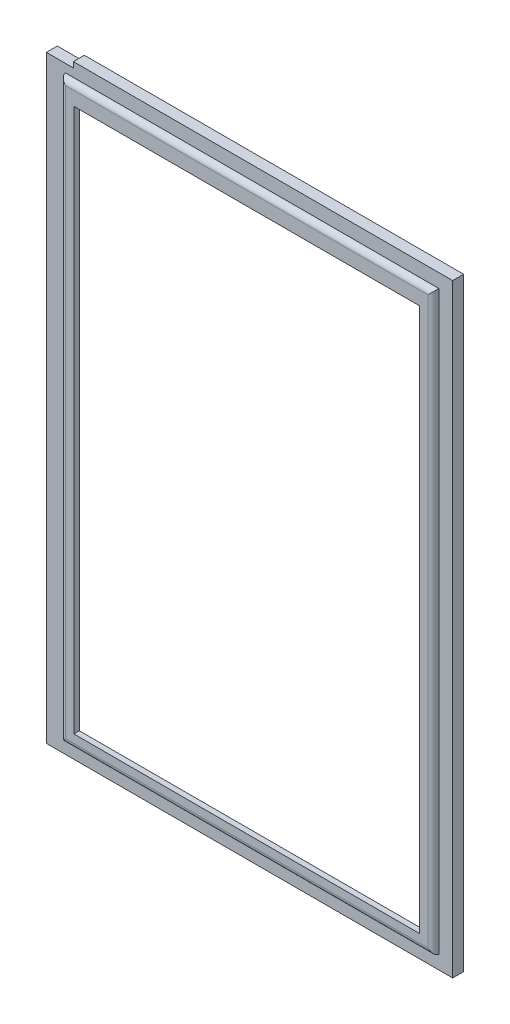
ISO-10303-21;
HEADER;
FILE_DESCRIPTION(('STEP AP214'),'2;1');
FILE_NAME('part.step','',(''),(''),'','','');
FILE_SCHEMA(('AUTOMOTIVE_DESIGN { 1 0 10303 214 1 1 1 1 }'));
ENDSEC;
DATA;
#1=APPLICATION_CONTEXT('core data for automotive mechanical design processes');
#2=APPLICATION_PROTOCOL_DEFINITION('international standard','automotive_design',2000,#1);
#3=PRODUCT_CONTEXT('',#1,'mechanical');
#4=PRODUCT('Part','Part','',(#3));
#5=PRODUCT_RELATED_PRODUCT_CATEGORY('part','',(#4));
#6=PRODUCT_DEFINITION_FORMATION('','',#4);
#7=PRODUCT_DEFINITION_CONTEXT('part definition',#1,'design');
#8=PRODUCT_DEFINITION('design','',#6,#7);
#9=PRODUCT_DEFINITION_SHAPE('','',#8);
#10=(LENGTH_UNIT() NAMED_UNIT(*) SI_UNIT(.MILLI.,.METRE.));
#11=(NAMED_UNIT(*) PLANE_ANGLE_UNIT() SI_UNIT($,.RADIAN.));
#12=(NAMED_UNIT(*) SI_UNIT($,.STERADIAN.) SOLID_ANGLE_UNIT());
#13=UNCERTAINTY_MEASURE_WITH_UNIT(LENGTH_MEASURE(1.E-05),#10,'distance_accuracy_value','');
#14=(GEOMETRIC_REPRESENTATION_CONTEXT(3) GLOBAL_UNCERTAINTY_ASSIGNED_CONTEXT((#13)) GLOBAL_UNIT_ASSIGNED_CONTEXT((#10,
#11,#12)) REPRESENTATION_CONTEXT('',''));
#15=CARTESIAN_POINT('',(0.,0.,0.));
#16=DIRECTION('',(0.,0.,1.));
#17=DIRECTION('',(1.,0.,0.));
#18=AXIS2_PLACEMENT_3D('',#15,#16,#17);
#19=CARTESIAN_POINT('',(0.,-1065.,20.));
#20=DIRECTION('',(-1.,0.,0.));
#21=DIRECTION('',(0.,0.,1.));
#22=AXIS2_PLACEMENT_3D('',#19,#20,#21);
#23=CYLINDRICAL_SURFACE('',#22,10.);
#24=CARTESIAN_POINT('',(705.,-1065.,20.));
#25=DIRECTION('',(-0.707106781186547,-0.707106781186548,0.));
#26=DIRECTION('',(0.707106781186547,-0.707106781186547,0.));
#27=AXIS2_PLACEMENT_3D('',#24,#25,#26);
#28=ELLIPSE('',#27,14.142135623731,10.);
#29=CARTESIAN_POINT('',(705.,-1065.,30.));
#30=VERTEX_POINT('',#29);
#31=CARTESIAN_POINT('',(715.,-1075.,20.));
#32=VERTEX_POINT('',#31);
#33=EDGE_CURVE('E12',#30,#32,#28,.F.);
#34=ORIENTED_EDGE('',*,*,#33,.F.);
#35=DIRECTION('',(1.,0.,0.));
#36=VECTOR('',#35,1.);
#37=CARTESIAN_POINT('',(0.,-1065.,30.));
#38=LINE('',#37,#36);
#39=CARTESIAN_POINT('',(45.0000000000001,-1065.,30.));
#40=VERTEX_POINT('',#39);
#41=EDGE_CURVE('E161',#40,#30,#38,.T.);
#42=ORIENTED_EDGE('',*,*,#41,.F.);
#43=CARTESIAN_POINT('',(45.0000000000001,-1065.,20.));
#44=DIRECTION('',(-0.707106781186548,0.707106781186547,0.));
#45=DIRECTION('',(-0.707106781186547,-0.707106781186548,0.));
#46=AXIS2_PLACEMENT_3D('',#43,#44,#45);
#47=ELLIPSE('',#46,14.1421356237309,10.);
#48=CARTESIAN_POINT('',(35.0000000000001,-1075.,20.));
#49=VERTEX_POINT('',#48);
#50=EDGE_CURVE('E51',#40,#49,#47,.F.);
#51=ORIENTED_EDGE('',*,*,#50,.T.);
#52=DIRECTION('',(1.,0.,0.));
#53=VECTOR('',#52,1.);
#54=CARTESIAN_POINT('',(35.0000000000001,-1075.,20.));
#55=LINE('',#54,#53);
#56=EDGE_CURVE('E154',#49,#32,#55,.T.);
#57=ORIENTED_EDGE('',*,*,#56,.T.);
#58=EDGE_LOOP('',(#34,#42,#51,#57));
#59=FACE_BOUND('',#58,.T.);
#60=ADVANCED_FACE('F44',(#59),#23,.T.);
#61=CARTESIAN_POINT('',(45.,0.,20.));
#62=DIRECTION('',(0.,1.,0.));
#63=DIRECTION('',(-1.,0.,0.));
#64=AXIS2_PLACEMENT_3D('',#61,#62,#63);
#65=CYLINDRICAL_SURFACE('',#64,10.);
#66=ORIENTED_EDGE('',*,*,#50,.F.);
#67=DIRECTION('',(0.,-1.,0.));
#68=VECTOR('',#67,1.);
#69=CARTESIAN_POINT('',(45.,0.,30.));
#70=LINE('',#69,#68);
#71=CARTESIAN_POINT('',(45.,-35.,30.));
#72=VERTEX_POINT('',#71);
#73=EDGE_CURVE('E164',#72,#40,#70,.T.);
#74=ORIENTED_EDGE('',*,*,#73,.F.);
#75=CARTESIAN_POINT('',(45.,-35.,20.));
#76=DIRECTION('',(0.707106781186547,0.707106781186548,0.));
#77=DIRECTION('',(-0.707106781186548,0.707106781186547,0.));
#78=AXIS2_PLACEMENT_3D('',#75,#76,#77);
#79=ELLIPSE('',#78,14.142135623731,10.);
#80=CARTESIAN_POINT('',(35.,-25.,20.));
#81=VERTEX_POINT('',#80);
#82=EDGE_CURVE('E66',#72,#81,#79,.F.);
#83=ORIENTED_EDGE('',*,*,#82,.T.);
#84=DIRECTION('',(0.,-1.,0.));
#85=VECTOR('',#84,1.);
#86=CARTESIAN_POINT('',(35.,-25.,20.));
#87=LINE('',#86,#85);
#88=EDGE_CURVE('E128',#81,#49,#87,.T.);
#89=ORIENTED_EDGE('',*,*,#88,.T.);
#90=EDGE_LOOP('',(#66,#74,#83,#89));
#91=FACE_BOUND('',#90,.T.);
#92=ADVANCED_FACE('F183',(#91),#65,.T.);
#93=CARTESIAN_POINT('',(0.,-35.,20.));
#94=DIRECTION('',(1.,0.,0.));
#95=DIRECTION('',(0.,1.,0.));
#96=AXIS2_PLACEMENT_3D('',#93,#94,#95);
#97=CYLINDRICAL_SURFACE('',#96,10.);
#98=ORIENTED_EDGE('',*,*,#82,.F.);
#99=DIRECTION('',(-1.,0.,0.));
#100=VECTOR('',#99,1.);
#101=CARTESIAN_POINT('',(0.,-35.,30.));
#102=LINE('',#101,#100);
#103=CARTESIAN_POINT('',(705.,-35.,30.));
#104=VERTEX_POINT('',#103);
#105=EDGE_CURVE('E167',#104,#72,#102,.T.);
#106=ORIENTED_EDGE('',*,*,#105,.F.);
#107=CARTESIAN_POINT('',(705.,-35.,20.));
#108=DIRECTION('',(0.707106781186547,-0.707106781186547,0.));
#109=DIRECTION('',(0.707106781186547,0.707106781186548,0.));
#110=AXIS2_PLACEMENT_3D('',#107,#108,#109);
#111=ELLIPSE('',#110,14.1421356237309,10.);
#112=CARTESIAN_POINT('',(715.,-25.,20.));
#113=VERTEX_POINT('',#112);
#114=EDGE_CURVE('E58',#104,#113,#111,.F.);
#115=ORIENTED_EDGE('',*,*,#114,.T.);
#116=DIRECTION('',(-1.,0.,0.));
#117=VECTOR('',#116,1.);
#118=CARTESIAN_POINT('',(35.,-25.,20.));
#119=LINE('',#118,#117);
#120=EDGE_CURVE('E159',#113,#81,#119,.T.);
#121=ORIENTED_EDGE('',*,*,#120,.T.);
#122=EDGE_LOOP('',(#98,#106,#115,#121));
#123=FACE_BOUND('',#122,.T.);
#124=ADVANCED_FACE('F184',(#123),#97,.T.);
#125=CARTESIAN_POINT('',(705.,0.,20.));
#126=DIRECTION('',(0.,-1.,0.));
#127=DIRECTION('',(1.,0.,0.));
#128=AXIS2_PLACEMENT_3D('',#125,#126,#127);
#129=CYLINDRICAL_SURFACE('',#128,10.);
#130=DIRECTION('',(0.,1.,0.));
#131=VECTOR('',#130,1.);
#132=CARTESIAN_POINT('',(705.,0.,30.));
#133=LINE('',#132,#131);
#134=EDGE_CURVE('E169',#30,#104,#133,.T.);
#135=ORIENTED_EDGE('',*,*,#134,.F.);
#136=ORIENTED_EDGE('',*,*,#33,.T.);
#137=DIRECTION('',(0.,1.,0.));
#138=VECTOR('',#137,1.);
#139=CARTESIAN_POINT('',(715.,-25.,20.));
#140=LINE('',#139,#138);
#141=EDGE_CURVE('E157',#32,#113,#140,.T.);
#142=ORIENTED_EDGE('',*,*,#141,.T.);
#143=ORIENTED_EDGE('',*,*,#114,.F.);
#144=EDGE_LOOP('',(#135,#136,#142,#143));
#145=FACE_BOUND('',#144,.T.);
#146=ADVANCED_FACE('F185',(#145),#129,.T.);
#147=CARTESIAN_POINT('',(0.,0.,30.));
#148=DIRECTION('',(0.,0.,1.));
#149=DIRECTION('',(1.,0.,0.));
#150=AXIS2_PLACEMENT_3D('',#147,#148,#149);
#151=PLANE('',#150);
#152=ORIENTED_EDGE('',*,*,#41,.T.);
#153=ORIENTED_EDGE('',*,*,#134,.T.);
#154=ORIENTED_EDGE('',*,*,#105,.T.);
#155=ORIENTED_EDGE('',*,*,#73,.T.);
#156=EDGE_LOOP('',(#152,#153,#154,#155));
#157=FACE_BOUND('',#156,.T.);
#158=DIRECTION('',(1.,0.,0.));
#159=VECTOR('',#158,1.);
#160=CARTESIAN_POINT('',(60.0000000000001,-1050.,30.));
#161=LINE('',#160,#159);
#162=CARTESIAN_POINT('',(60.0000000000001,-1050.,30.));
#163=VERTEX_POINT('',#162);
#164=CARTESIAN_POINT('',(690.,-1050.,30.));
#165=VERTEX_POINT('',#164);
#166=EDGE_CURVE('E120',#163,#165,#161,.T.);
#167=ORIENTED_EDGE('',*,*,#166,.F.);
#168=DIRECTION('',(0.,-1.,0.));
#169=VECTOR('',#168,1.);
#170=CARTESIAN_POINT('',(60.0000000000001,-1050.,30.));
#171=LINE('',#170,#169);
#172=CARTESIAN_POINT('',(60.0000000000001,-60.,30.));
#173=VERTEX_POINT('',#172);
#174=EDGE_CURVE('E110',#173,#163,#171,.T.);
#175=ORIENTED_EDGE('',*,*,#174,.F.);
#176=DIRECTION('',(-1.,0.,0.));
#177=VECTOR('',#176,1.);
#178=CARTESIAN_POINT('',(60.0000000000001,-60.,30.));
#179=LINE('',#178,#177);
#180=CARTESIAN_POINT('',(690.,-60.0000000000001,30.));
#181=VERTEX_POINT('',#180);
#182=EDGE_CURVE('E136',#181,#173,#179,.T.);
#183=ORIENTED_EDGE('',*,*,#182,.F.);
#184=DIRECTION('',(0.,1.,0.));
#185=VECTOR('',#184,1.);
#186=CARTESIAN_POINT('',(690.,-1050.,30.));
#187=LINE('',#186,#185);
#188=EDGE_CURVE('E134',#165,#181,#187,.T.);
#189=ORIENTED_EDGE('',*,*,#188,.F.);
#190=EDGE_LOOP('',(#167,#175,#183,#189));
#191=FACE_BOUND('',#190,.T.);
#192=ADVANCED_FACE('F132',(#157,#191),#151,.T.);
#193=CARTESIAN_POINT('',(0.,0.,20.));
#194=DIRECTION('',(0.,0.,1.));
#195=DIRECTION('',(1.,0.,0.));
#196=AXIS2_PLACEMENT_3D('',#193,#194,#195);
#197=PLANE('',#196);
#198=ORIENTED_EDGE('',*,*,#88,.F.);
#199=ORIENTED_EDGE('',*,*,#120,.F.);
#200=ORIENTED_EDGE('',*,*,#141,.F.);
#201=ORIENTED_EDGE('',*,*,#56,.F.);
#202=EDGE_LOOP('',(#198,#199,#200,#201));
#203=FACE_BOUND('',#202,.T.);
#204=DIRECTION('',(0.,-1.,0.));
#205=VECTOR('',#204,1.);
#206=CARTESIAN_POINT('',(60.0000000000001,-1050.,20.));
#207=LINE('',#206,#205);
#208=CARTESIAN_POINT('',(60.0000000000001,-60.,20.));
#209=VERTEX_POINT('',#208);
#210=CARTESIAN_POINT('',(60.0000000000001,-1050.,20.));
#211=VERTEX_POINT('',#210);
#212=EDGE_CURVE('E140',#209,#211,#207,.T.);
#213=ORIENTED_EDGE('',*,*,#212,.T.);
#214=DIRECTION('',(1.,0.,0.));
#215=VECTOR('',#214,1.);
#216=CARTESIAN_POINT('',(60.0000000000001,-1050.,20.));
#217=LINE('',#216,#215);
#218=CARTESIAN_POINT('',(690.,-1050.,20.));
#219=VERTEX_POINT('',#218);
#220=EDGE_CURVE('E127',#211,#219,#217,.T.);
#221=ORIENTED_EDGE('',*,*,#220,.T.);
#222=DIRECTION('',(0.,1.,0.));
#223=VECTOR('',#222,1.);
#224=CARTESIAN_POINT('',(690.,-1050.,20.));
#225=LINE('',#224,#223);
#226=CARTESIAN_POINT('',(690.,-60.0000000000001,20.));
#227=VERTEX_POINT('',#226);
#228=EDGE_CURVE('E143',#219,#227,#225,.T.);
#229=ORIENTED_EDGE('',*,*,#228,.T.);
#230=DIRECTION('',(-1.,0.,0.));
#231=VECTOR('',#230,1.);
#232=CARTESIAN_POINT('',(60.0000000000001,-60.,20.));
#233=LINE('',#232,#231);
#234=EDGE_CURVE('E121',#227,#209,#233,.T.);
#235=ORIENTED_EDGE('',*,*,#234,.T.);
#236=EDGE_LOOP('',(#213,#221,#229,#235));
#237=FACE_BOUND('',#236,.T.);
#238=ADVANCED_FACE('F180',(#203,#237),#197,.F.);
#239=CARTESIAN_POINT('',(60.0000000000001,-1050.,30.));
#240=DIRECTION('',(1.,0.,0.));
#241=DIRECTION('',(0.,0.,-1.));
#242=AXIS2_PLACEMENT_3D('',#239,#240,#241);
#243=PLANE('',#242);
#244=ORIENTED_EDGE('',*,*,#212,.F.);
#245=DIRECTION('',(0.,0.,-1.));
#246=VECTOR('',#245,1.);
#247=CARTESIAN_POINT('',(60.0000000000001,-60.,30.));
#248=LINE('',#247,#246);
#249=EDGE_CURVE('E116',#173,#209,#248,.T.);
#250=ORIENTED_EDGE('',*,*,#249,.F.);
#251=ORIENTED_EDGE('',*,*,#174,.T.);
#252=DIRECTION('',(0.,0.,-1.));
#253=VECTOR('',#252,1.);
#254=CARTESIAN_POINT('',(60.0000000000001,-1050.,30.));
#255=LINE('',#254,#253);
#256=EDGE_CURVE('E113',#163,#211,#255,.T.);
#257=ORIENTED_EDGE('',*,*,#256,.T.);
#258=EDGE_LOOP('',(#244,#250,#251,#257));
#259=FACE_BOUND('',#258,.T.);
#260=ADVANCED_FACE('F112',(#259),#243,.T.);
#261=CARTESIAN_POINT('',(60.0000000000001,-1050.,30.));
#262=DIRECTION('',(0.,1.,0.));
#263=DIRECTION('',(0.,0.,1.));
#264=AXIS2_PLACEMENT_3D('',#261,#262,#263);
#265=PLANE('',#264);
#266=ORIENTED_EDGE('',*,*,#220,.F.);
#267=ORIENTED_EDGE('',*,*,#256,.F.);
#268=ORIENTED_EDGE('',*,*,#166,.T.);
#269=DIRECTION('',(0.,0.,-1.));
#270=VECTOR('',#269,1.);
#271=CARTESIAN_POINT('',(690.,-1050.,30.));
#272=LINE('',#271,#270);
#273=EDGE_CURVE('E129',#165,#219,#272,.T.);
#274=ORIENTED_EDGE('',*,*,#273,.T.);
#275=EDGE_LOOP('',(#266,#267,#268,#274));
#276=FACE_BOUND('',#275,.T.);
#277=ADVANCED_FACE('F124',(#276),#265,.T.);
#278=CARTESIAN_POINT('',(690.,-1050.,30.));
#279=DIRECTION('',(-1.,0.,0.));
#280=DIRECTION('',(0.,0.,1.));
#281=AXIS2_PLACEMENT_3D('',#278,#279,#280);
#282=PLANE('',#281);
#283=ORIENTED_EDGE('',*,*,#228,.F.);
#284=ORIENTED_EDGE('',*,*,#273,.F.);
#285=ORIENTED_EDGE('',*,*,#188,.T.);
#286=DIRECTION('',(0.,0.,-1.));
#287=VECTOR('',#286,1.);
#288=CARTESIAN_POINT('',(690.,-60.0000000000001,30.));
#289=LINE('',#288,#287);
#290=EDGE_CURVE('E149',#181,#227,#289,.T.);
#291=ORIENTED_EDGE('',*,*,#290,.T.);
#292=EDGE_LOOP('',(#283,#284,#285,#291));
#293=FACE_BOUND('',#292,.T.);
#294=ADVANCED_FACE('F235',(#293),#282,.T.);
#295=CARTESIAN_POINT('',(60.0000000000001,-60.,30.));
#296=DIRECTION('',(0.,-1.,0.));
#297=DIRECTION('',(1.,0.,0.));
#298=AXIS2_PLACEMENT_3D('',#295,#296,#297);
#299=PLANE('',#298);
#300=ORIENTED_EDGE('',*,*,#234,.F.);
#301=ORIENTED_EDGE('',*,*,#290,.F.);
#302=ORIENTED_EDGE('',*,*,#182,.T.);
#303=ORIENTED_EDGE('',*,*,#249,.T.);
#304=EDGE_LOOP('',(#300,#301,#302,#303));
#305=FACE_BOUND('',#304,.T.);
#306=ADVANCED_FACE('F243',(#305),#299,.T.);
#307=CLOSED_SHELL('',(#60,#92,#124,#146,#192,#238,#260,#277,#294,#306));
#308=MANIFOLD_SOLID_BREP('B2',#307);
#309=CARTESIAN_POINT('',(0.,0.,20.));
#310=DIRECTION('',(0.,0.,1.));
#311=DIRECTION('',(1.,0.,0.));
#312=AXIS2_PLACEMENT_3D('',#309,#310,#311);
#313=PLANE('',#312);
#314=DIRECTION('',(0.,1.,0.));
#315=VECTOR('',#314,1.);
#316=CARTESIAN_POINT('',(49.143238,0.,20.));
#317=LINE('',#316,#315);
#318=CARTESIAN_POINT('',(49.143238,-10.,20.));
#319=VERTEX_POINT('',#318);
#320=CARTESIAN_POINT('',(49.143238,0.,20.));
#321=VERTEX_POINT('',#320);
#322=EDGE_CURVE('E288',#319,#321,#317,.T.);
#323=ORIENTED_EDGE('',*,*,#322,.F.);
#324=DIRECTION('',(1.,0.,0.));
#325=VECTOR('',#324,1.);
#326=CARTESIAN_POINT('',(0.,-10.,20.));
#327=LINE('',#326,#325);
#328=CARTESIAN_POINT('',(0.,-10.,20.));
#329=VERTEX_POINT('',#328);
#330=EDGE_CURVE('E438',#329,#319,#327,.T.);
#331=ORIENTED_EDGE('',*,*,#330,.F.);
#332=DIRECTION('',(0.,-1.,0.));
#333=VECTOR('',#332,1.);
#334=CARTESIAN_POINT('',(0.,0.,20.));
#335=LINE('',#334,#333);
#336=CARTESIAN_POINT('',(1.34711147906209E-13,-1100.,20.));
#337=VERTEX_POINT('',#336);
#338=EDGE_CURVE('E368',#329,#337,#335,.T.);
#339=ORIENTED_EDGE('',*,*,#338,.T.);
#340=DIRECTION('',(1.,0.,0.));
#341=VECTOR('',#340,1.);
#342=CARTESIAN_POINT('',(1.34711147906209E-13,-1100.,20.));
#343=LINE('',#342,#341);
#344=CARTESIAN_POINT('',(740.,-1100.,20.));
#345=VERTEX_POINT('',#344);
#346=EDGE_CURVE('E407',#337,#345,#343,.T.);
#347=ORIENTED_EDGE('',*,*,#346,.T.);
#348=DIRECTION('',(0.,1.,0.));
#349=VECTOR('',#348,1.);
#350=CARTESIAN_POINT('',(740.,-1100.,20.));
#351=LINE('',#350,#349);
#352=CARTESIAN_POINT('',(740.,0.,20.));
#353=VERTEX_POINT('',#352);
#354=EDGE_CURVE('E397',#345,#353,#351,.T.);
#355=ORIENTED_EDGE('',*,*,#354,.T.);
#356=DIRECTION('',(-1.,0.,0.));
#357=VECTOR('',#356,1.);
#358=CARTESIAN_POINT('',(0.,0.,20.));
#359=LINE('',#358,#357);
#360=EDGE_CURVE('E382',#353,#321,#359,.T.);
#361=ORIENTED_EDGE('',*,*,#360,.T.);
#362=EDGE_LOOP('',(#323,#331,#339,#347,#355,#361));
#363=FACE_BOUND('',#362,.T.);
#364=DIRECTION('',(1.,0.,0.));
#365=VECTOR('',#364,1.);
#366=CARTESIAN_POINT('',(35.0000000000001,-1075.,20.));
#367=LINE('',#366,#365);
#368=CARTESIAN_POINT('',(35.0000000000001,-1075.,20.));
#369=VERTEX_POINT('',#368);
#370=CARTESIAN_POINT('',(715.,-1075.,20.));
#371=VERTEX_POINT('',#370);
#372=EDGE_CURVE('E432',#369,#371,#367,.T.);
#373=ORIENTED_EDGE('',*,*,#372,.F.);
#374=DIRECTION('',(0.,-1.,0.));
#375=VECTOR('',#374,1.);
#376=CARTESIAN_POINT('',(35.,-25.,20.));
#377=LINE('',#376,#375);
#378=CARTESIAN_POINT('',(35.,-25.,20.));
#379=VERTEX_POINT('',#378);
#380=EDGE_CURVE('E420',#379,#369,#377,.T.);
#381=ORIENTED_EDGE('',*,*,#380,.F.);
#382=DIRECTION('',(-1.,0.,0.));
#383=VECTOR('',#382,1.);
#384=CARTESIAN_POINT('',(35.,-25.,20.));
#385=LINE('',#384,#383);
#386=CARTESIAN_POINT('',(715.,-25.,20.));
#387=VERTEX_POINT('',#386);
#388=EDGE_CURVE('E416',#387,#379,#385,.T.);
#389=ORIENTED_EDGE('',*,*,#388,.F.);
#390=DIRECTION('',(0.,1.,0.));
#391=VECTOR('',#390,1.);
#392=CARTESIAN_POINT('',(715.,-25.,20.));
#393=LINE('',#392,#391);
#394=EDGE_CURVE('E430',#371,#387,#393,.T.);
#395=ORIENTED_EDGE('',*,*,#394,.F.);
#396=EDGE_LOOP('',(#373,#381,#389,#395));
#397=FACE_BOUND('',#396,.T.);
#398=ADVANCED_FACE('F273',(#363,#397),#313,.T.);
#399=CARTESIAN_POINT('',(0.,0.,0.));
#400=DIRECTION('',(0.,0.,1.));
#401=DIRECTION('',(1.,0.,0.));
#402=AXIS2_PLACEMENT_3D('',#399,#400,#401);
#403=PLANE('',#402);
#404=DIRECTION('',(-1.,0.,0.));
#405=VECTOR('',#404,1.);
#406=CARTESIAN_POINT('',(0.,-10.,0.));
#407=LINE('',#406,#405);
#408=CARTESIAN_POINT('',(49.143238,-10.,0.));
#409=VERTEX_POINT('',#408);
#410=CARTESIAN_POINT('',(0.,-10.,0.));
#411=VERTEX_POINT('',#410);
#412=EDGE_CURVE('E349',#409,#411,#407,.T.);
#413=ORIENTED_EDGE('',*,*,#412,.F.);
#414=DIRECTION('',(0.,-1.,0.));
#415=VECTOR('',#414,1.);
#416=CARTESIAN_POINT('',(49.143238,0.,0.));
#417=LINE('',#416,#415);
#418=CARTESIAN_POINT('',(49.143238,0.,0.));
#419=VERTEX_POINT('',#418);
#420=EDGE_CURVE('E401',#419,#409,#417,.T.);
#421=ORIENTED_EDGE('',*,*,#420,.F.);
#422=DIRECTION('',(-1.,0.,0.));
#423=VECTOR('',#422,1.);
#424=CARTESIAN_POINT('',(0.,0.,0.));
#425=LINE('',#424,#423);
#426=CARTESIAN_POINT('',(740.,0.,0.));
#427=VERTEX_POINT('',#426);
#428=EDGE_CURVE('E386',#427,#419,#425,.T.);
#429=ORIENTED_EDGE('',*,*,#428,.F.);
#430=DIRECTION('',(0.,1.,0.));
#431=VECTOR('',#430,1.);
#432=CARTESIAN_POINT('',(740.,-1100.,0.));
#433=LINE('',#432,#431);
#434=CARTESIAN_POINT('',(740.,-1100.,0.));
#435=VERTEX_POINT('',#434);
#436=EDGE_CURVE('E376',#435,#427,#433,.T.);
#437=ORIENTED_EDGE('',*,*,#436,.F.);
#438=DIRECTION('',(1.,0.,0.));
#439=VECTOR('',#438,1.);
#440=CARTESIAN_POINT('',(1.34711147906209E-13,-1100.,0.));
#441=LINE('',#440,#439);
#442=CARTESIAN_POINT('',(1.34711147906209E-13,-1100.,0.));
#443=VERTEX_POINT('',#442);
#444=EDGE_CURVE('E373',#443,#435,#441,.T.);
#445=ORIENTED_EDGE('',*,*,#444,.F.);
#446=DIRECTION('',(0.,-1.,0.));
#447=VECTOR('',#446,1.);
#448=CARTESIAN_POINT('',(0.,0.,0.));
#449=LINE('',#448,#447);
#450=EDGE_CURVE('E366',#411,#443,#449,.T.);
#451=ORIENTED_EDGE('',*,*,#450,.F.);
#452=EDGE_LOOP('',(#413,#421,#429,#437,#445,#451));
#453=FACE_BOUND('',#452,.T.);
#454=DIRECTION('',(0.,-1.,0.));
#455=VECTOR('',#454,1.);
#456=CARTESIAN_POINT('',(35.,-25.,0.));
#457=LINE('',#456,#455);
#458=CARTESIAN_POINT('',(35.,-25.,0.));
#459=VERTEX_POINT('',#458);
#460=CARTESIAN_POINT('',(35.0000000000001,-1075.,0.));
#461=VERTEX_POINT('',#460);
#462=EDGE_CURVE('E360',#459,#461,#457,.T.);
#463=ORIENTED_EDGE('',*,*,#462,.T.);
#464=DIRECTION('',(1.,0.,0.));
#465=VECTOR('',#464,1.);
#466=CARTESIAN_POINT('',(35.0000000000001,-1075.,0.));
#467=LINE('',#466,#465);
#468=CARTESIAN_POINT('',(715.,-1075.,0.));
#469=VERTEX_POINT('',#468);
#470=EDGE_CURVE('E424',#461,#469,#467,.T.);
#471=ORIENTED_EDGE('',*,*,#470,.T.);
#472=DIRECTION('',(0.,1.,0.));
#473=VECTOR('',#472,1.);
#474=CARTESIAN_POINT('',(715.,-25.,0.));
#475=LINE('',#474,#473);
#476=CARTESIAN_POINT('',(715.,-25.,0.));
#477=VERTEX_POINT('',#476);
#478=EDGE_CURVE('E421',#469,#477,#475,.T.);
#479=ORIENTED_EDGE('',*,*,#478,.T.);
#480=DIRECTION('',(-1.,0.,0.));
#481=VECTOR('',#480,1.);
#482=CARTESIAN_POINT('',(35.,-25.,0.));
#483=LINE('',#482,#481);
#484=EDGE_CURVE('E417',#477,#459,#483,.T.);
#485=ORIENTED_EDGE('',*,*,#484,.T.);
#486=EDGE_LOOP('',(#463,#471,#479,#485));
#487=FACE_BOUND('',#486,.T.);
#488=ADVANCED_FACE('F370',(#453,#487),#403,.F.);
#489=CARTESIAN_POINT('',(0.,0.,20.));
#490=DIRECTION('',(1.,0.,0.));
#491=DIRECTION('',(0.,1.,0.));
#492=AXIS2_PLACEMENT_3D('',#489,#490,#491);
#493=PLANE('',#492);
#494=ORIENTED_EDGE('',*,*,#338,.F.);
#495=DIRECTION('',(0.,0.,1.));
#496=VECTOR('',#495,1.);
#497=CARTESIAN_POINT('',(0.,-10.,-0.001000000000001));
#498=LINE('',#497,#496);
#499=EDGE_CURVE('E353',#411,#329,#498,.T.);
#500=ORIENTED_EDGE('',*,*,#499,.F.);
#501=ORIENTED_EDGE('',*,*,#450,.T.);
#502=DIRECTION('',(0.,0.,-1.));
#503=VECTOR('',#502,1.);
#504=CARTESIAN_POINT('',(1.34711147906209E-13,-1100.,20.));
#505=LINE('',#504,#503);
#506=EDGE_CURVE('E42',#337,#443,#505,.T.);
#507=ORIENTED_EDGE('',*,*,#506,.F.);
#508=EDGE_LOOP('',(#494,#500,#501,#507));
#509=FACE_BOUND('',#508,.T.);
#510=ADVANCED_FACE('F275',(#509),#493,.F.);
#511=CARTESIAN_POINT('',(1.34711147906209E-13,-1100.,20.));
#512=DIRECTION('',(0.,1.,0.));
#513=DIRECTION('',(0.,0.,1.));
#514=AXIS2_PLACEMENT_3D('',#511,#512,#513);
#515=PLANE('',#514);
#516=ORIENTED_EDGE('',*,*,#444,.T.);
#517=DIRECTION('',(0.,0.,-1.));
#518=VECTOR('',#517,1.);
#519=CARTESIAN_POINT('',(740.,-1100.,20.));
#520=LINE('',#519,#518);
#521=EDGE_CURVE('E281',#345,#435,#520,.T.);
#522=ORIENTED_EDGE('',*,*,#521,.F.);
#523=ORIENTED_EDGE('',*,*,#346,.F.);
#524=ORIENTED_EDGE('',*,*,#506,.T.);
#525=EDGE_LOOP('',(#516,#522,#523,#524));
#526=FACE_BOUND('',#525,.T.);
#527=ADVANCED_FACE('F478',(#526),#515,.F.);
#528=CARTESIAN_POINT('',(740.,-1100.,20.));
#529=DIRECTION('',(-1.,0.,0.));
#530=DIRECTION('',(0.,-1.,0.));
#531=AXIS2_PLACEMENT_3D('',#528,#529,#530);
#532=PLANE('',#531);
#533=ORIENTED_EDGE('',*,*,#436,.T.);
#534=DIRECTION('',(0.,0.,-1.));
#535=VECTOR('',#534,1.);
#536=CARTESIAN_POINT('',(740.,0.,20.));
#537=LINE('',#536,#535);
#538=EDGE_CURVE('E389',#353,#427,#537,.T.);
#539=ORIENTED_EDGE('',*,*,#538,.F.);
#540=ORIENTED_EDGE('',*,*,#354,.F.);
#541=ORIENTED_EDGE('',*,*,#521,.T.);
#542=EDGE_LOOP('',(#533,#539,#540,#541));
#543=FACE_BOUND('',#542,.T.);
#544=ADVANCED_FACE('F395',(#543),#532,.F.);
#545=CARTESIAN_POINT('',(0.,0.,20.));
#546=DIRECTION('',(0.,-1.,0.));
#547=DIRECTION('',(0.,0.,-1.));
#548=AXIS2_PLACEMENT_3D('',#545,#546,#547);
#549=PLANE('',#548);
#550=ORIENTED_EDGE('',*,*,#428,.T.);
#551=DIRECTION('',(0.,0.,1.));
#552=VECTOR('',#551,1.);
#553=CARTESIAN_POINT('',(49.143238,0.,-0.001000000000001));
#554=LINE('',#553,#552);
#555=EDGE_CURVE('E361',#419,#321,#554,.T.);
#556=ORIENTED_EDGE('',*,*,#555,.T.);
#557=ORIENTED_EDGE('',*,*,#360,.F.);
#558=ORIENTED_EDGE('',*,*,#538,.T.);
#559=EDGE_LOOP('',(#550,#556,#557,#558));
#560=FACE_BOUND('',#559,.T.);
#561=ADVANCED_FACE('F403',(#560),#549,.F.);
#562=CARTESIAN_POINT('',(35.,-25.,20.));
#563=DIRECTION('',(1.,0.,0.));
#564=DIRECTION('',(0.,1.,0.));
#565=AXIS2_PLACEMENT_3D('',#562,#563,#564);
#566=PLANE('',#565);
#567=ORIENTED_EDGE('',*,*,#462,.F.);
#568=DIRECTION('',(0.,0.,-1.));
#569=VECTOR('',#568,1.);
#570=CARTESIAN_POINT('',(35.,-25.,20.));
#571=LINE('',#570,#569);
#572=EDGE_CURVE('E413',#379,#459,#571,.T.);
#573=ORIENTED_EDGE('',*,*,#572,.F.);
#574=ORIENTED_EDGE('',*,*,#380,.T.);
#575=DIRECTION('',(0.,0.,-1.));
#576=VECTOR('',#575,1.);
#577=CARTESIAN_POINT('',(35.0000000000001,-1075.,20.));
#578=LINE('',#577,#576);
#579=EDGE_CURVE('E374',#369,#461,#578,.T.);
#580=ORIENTED_EDGE('',*,*,#579,.T.);
#581=EDGE_LOOP('',(#567,#573,#574,#580));
#582=FACE_BOUND('',#581,.T.);
#583=ADVANCED_FACE('F456',(#582),#566,.T.);
#584=CARTESIAN_POINT('',(35.0000000000001,-1075.,20.));
#585=DIRECTION('',(0.,1.,0.));
#586=DIRECTION('',(0.,0.,1.));
#587=AXIS2_PLACEMENT_3D('',#584,#585,#586);
#588=PLANE('',#587);
#589=ORIENTED_EDGE('',*,*,#470,.F.);
#590=ORIENTED_EDGE('',*,*,#579,.F.);
#591=ORIENTED_EDGE('',*,*,#372,.T.);
#592=DIRECTION('',(0.,0.,-1.));
#593=VECTOR('',#592,1.);
#594=CARTESIAN_POINT('',(715.,-1075.,20.));
#595=LINE('',#594,#593);
#596=EDGE_CURVE('E379',#371,#469,#595,.T.);
#597=ORIENTED_EDGE('',*,*,#596,.T.);
#598=EDGE_LOOP('',(#589,#590,#591,#597));
#599=FACE_BOUND('',#598,.T.);
#600=ADVANCED_FACE('F451',(#599),#588,.T.);
#601=CARTESIAN_POINT('',(715.,-25.,20.));
#602=DIRECTION('',(-1.,0.,0.));
#603=DIRECTION('',(0.,-1.,0.));
#604=AXIS2_PLACEMENT_3D('',#601,#602,#603);
#605=PLANE('',#604);
#606=ORIENTED_EDGE('',*,*,#478,.F.);
#607=ORIENTED_EDGE('',*,*,#596,.F.);
#608=ORIENTED_EDGE('',*,*,#394,.T.);
#609=DIRECTION('',(0.,0.,-1.));
#610=VECTOR('',#609,1.);
#611=CARTESIAN_POINT('',(715.,-25.,20.));
#612=LINE('',#611,#610);
#613=EDGE_CURVE('E296',#387,#477,#612,.T.);
#614=ORIENTED_EDGE('',*,*,#613,.T.);
#615=EDGE_LOOP('',(#606,#607,#608,#614));
#616=FACE_BOUND('',#615,.T.);
#617=ADVANCED_FACE('F454',(#616),#605,.T.);
#618=CARTESIAN_POINT('',(35.,-25.,20.));
#619=DIRECTION('',(0.,-1.,0.));
#620=DIRECTION('',(0.,0.,-1.));
#621=AXIS2_PLACEMENT_3D('',#618,#619,#620);
#622=PLANE('',#621);
#623=ORIENTED_EDGE('',*,*,#484,.F.);
#624=ORIENTED_EDGE('',*,*,#613,.F.);
#625=ORIENTED_EDGE('',*,*,#388,.T.);
#626=ORIENTED_EDGE('',*,*,#572,.T.);
#627=EDGE_LOOP('',(#623,#624,#625,#626));
#628=FACE_BOUND('',#627,.T.);
#629=ADVANCED_FACE('F458',(#628),#622,.T.);
#630=CARTESIAN_POINT('',(49.143238,0.,-0.001000000000001));
#631=DIRECTION('',(1.,0.,0.));
#632=DIRECTION('',(0.,0.,-1.));
#633=AXIS2_PLACEMENT_3D('',#630,#631,#632);
#634=PLANE('',#633);
#635=ORIENTED_EDGE('',*,*,#420,.T.);
#636=DIRECTION('',(0.,0.,1.));
#637=VECTOR('',#636,1.);
#638=CARTESIAN_POINT('',(49.143238,-10.,-0.001000000000001));
#639=LINE('',#638,#637);
#640=EDGE_CURVE('E355',#409,#319,#639,.T.);
#641=ORIENTED_EDGE('',*,*,#640,.T.);
#642=ORIENTED_EDGE('',*,*,#322,.T.);
#643=ORIENTED_EDGE('',*,*,#555,.F.);
#644=EDGE_LOOP('',(#635,#641,#642,#643));
#645=FACE_BOUND('',#644,.T.);
#646=ADVANCED_FACE('F440',(#645),#634,.F.);
#647=CARTESIAN_POINT('',(0.,-10.,-0.001000000000001));
#648=DIRECTION('',(0.,-1.,0.));
#649=DIRECTION('',(0.,0.,-1.));
#650=AXIS2_PLACEMENT_3D('',#647,#648,#649);
#651=PLANE('',#650);
#652=ORIENTED_EDGE('',*,*,#412,.T.);
#653=ORIENTED_EDGE('',*,*,#499,.T.);
#654=ORIENTED_EDGE('',*,*,#330,.T.);
#655=ORIENTED_EDGE('',*,*,#640,.F.);
#656=EDGE_LOOP('',(#652,#653,#654,#655));
#657=FACE_BOUND('',#656,.T.);
#658=ADVANCED_FACE('F351',(#657),#651,.F.);
#659=CLOSED_SHELL('',(#398,#488,#510,#527,#544,#561,#583,#600,#617,#629,#646,#658));
#660=MANIFOLD_SOLID_BREP('B6',#659);
#661=ADVANCED_BREP_SHAPE_REPRESENTATION('',(#18,#308,#660),#14);
#662=SHAPE_DEFINITION_REPRESENTATION(#9,#661);
ENDSEC;
END-ISO-10303-21;
